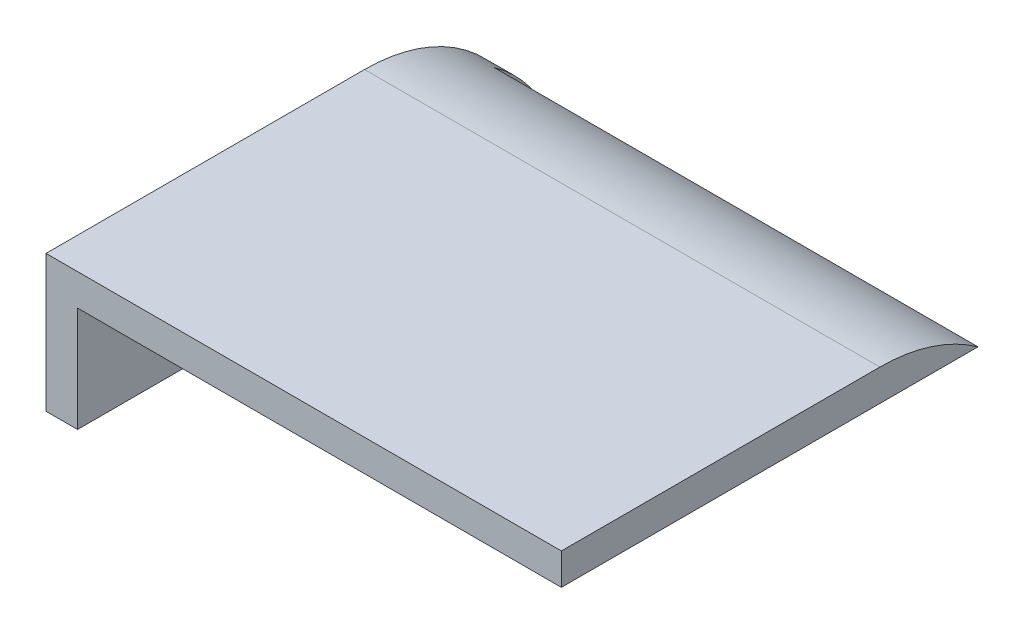
ISO-10303-21;
HEADER;
FILE_DESCRIPTION(('STEP AP214'),'2;1');
FILE_NAME('part.step','',(''),(''),'','','');
FILE_SCHEMA(('AUTOMOTIVE_DESIGN { 1 0 10303 214 1 1 1 1 }'));
ENDSEC;
DATA;
#1=APPLICATION_CONTEXT('core data for automotive mechanical design processes');
#2=APPLICATION_PROTOCOL_DEFINITION('international standard','automotive_design',2000,#1);
#3=PRODUCT_CONTEXT('',#1,'mechanical');
#4=PRODUCT('Part','Part','',(#3));
#5=PRODUCT_RELATED_PRODUCT_CATEGORY('part','',(#4));
#6=PRODUCT_DEFINITION_FORMATION('','',#4);
#7=PRODUCT_DEFINITION_CONTEXT('part definition',#1,'design');
#8=PRODUCT_DEFINITION('design','',#6,#7);
#9=PRODUCT_DEFINITION_SHAPE('','',#8);
#10=(LENGTH_UNIT() NAMED_UNIT(*) SI_UNIT(.MILLI.,.METRE.));
#11=(NAMED_UNIT(*) PLANE_ANGLE_UNIT() SI_UNIT($,.RADIAN.));
#12=(NAMED_UNIT(*) SI_UNIT($,.STERADIAN.) SOLID_ANGLE_UNIT());
#13=UNCERTAINTY_MEASURE_WITH_UNIT(LENGTH_MEASURE(1.E-05),#10,'distance_accuracy_value','');
#14=(GEOMETRIC_REPRESENTATION_CONTEXT(3) GLOBAL_UNCERTAINTY_ASSIGNED_CONTEXT((#13)) GLOBAL_UNIT_ASSIGNED_CONTEXT((#10,
#11,#12)) REPRESENTATION_CONTEXT('',''));
#15=CARTESIAN_POINT('',(0.,0.,0.));
#16=DIRECTION('',(0.,0.,1.));
#17=DIRECTION('',(1.,0.,0.));
#18=AXIS2_PLACEMENT_3D('',#15,#16,#17);
#19=CARTESIAN_POINT('',(3.,0.,46.));
#20=DIRECTION('',(0.,1.,0.));
#21=DIRECTION('',(-1.,0.,0.));
#22=AXIS2_PLACEMENT_3D('',#19,#20,#21);
#23=PLANE('',#22);
#24=DIRECTION('',(1.,0.,0.));
#25=VECTOR('',#24,1.);
#26=CARTESIAN_POINT('',(3.,0.,0.));
#27=LINE('',#26,#25);
#28=CARTESIAN_POINT('',(0.,0.,0.));
#29=VERTEX_POINT('',#28);
#30=CARTESIAN_POINT('',(3.,0.,0.));
#31=VERTEX_POINT('',#30);
#32=EDGE_CURVE('E102',#29,#31,#27,.T.);
#33=ORIENTED_EDGE('',*,*,#32,.T.);
#34=DIRECTION('',(0.,0.,-1.));
#35=VECTOR('',#34,1.);
#36=CARTESIAN_POINT('',(3.,0.,46.));
#37=LINE('',#36,#35);
#38=CARTESIAN_POINT('',(3.,0.,46.));
#39=VERTEX_POINT('',#38);
#40=EDGE_CURVE('E87',#39,#31,#37,.T.);
#41=ORIENTED_EDGE('',*,*,#40,.F.);
#42=DIRECTION('',(1.,0.,0.));
#43=VECTOR('',#42,1.);
#44=CARTESIAN_POINT('',(3.,0.,46.));
#45=LINE('',#44,#43);
#46=CARTESIAN_POINT('',(0.,0.,46.));
#47=VERTEX_POINT('',#46);
#48=EDGE_CURVE('E93',#47,#39,#45,.T.);
#49=ORIENTED_EDGE('',*,*,#48,.F.);
#50=DIRECTION('',(0.,0.,-1.));
#51=VECTOR('',#50,1.);
#52=CARTESIAN_POINT('',(0.,0.,46.));
#53=LINE('',#52,#51);
#54=EDGE_CURVE('E118',#47,#29,#53,.T.);
#55=ORIENTED_EDGE('',*,*,#54,.T.);
#56=EDGE_LOOP('',(#33,#41,#49,#55));
#57=FACE_BOUND('',#56,.T.);
#58=ADVANCED_FACE('F33',(#57),#23,.F.);
#59=CARTESIAN_POINT('',(3.,9.99999999999999,46.));
#60=DIRECTION('',(-1.,0.,0.));
#61=DIRECTION('',(0.,-1.,0.));
#62=AXIS2_PLACEMENT_3D('',#59,#60,#61);
#63=PLANE('',#62);
#64=ORIENTED_EDGE('',*,*,#40,.T.);
#65=CARTESIAN_POINT('',(3.,-3.,15.7162336455017));
#66=DIRECTION('',(-1.,0.,0.));
#67=DIRECTION('',(0.,-1.,0.));
#68=AXIS2_PLACEMENT_3D('',#65,#66,#67);
#69=CIRCLE('',#68,16.);
#70=CARTESIAN_POINT('',(3.,9.99999999999999,6.3888545924129));
#71=VERTEX_POINT('',#70);
#72=EDGE_CURVE('E55',#31,#71,#69,.F.);
#73=ORIENTED_EDGE('',*,*,#72,.T.);
#74=DIRECTION('',(0.,0.,-1.));
#75=VECTOR('',#74,1.);
#76=CARTESIAN_POINT('',(3.,9.99999999999999,46.));
#77=LINE('',#76,#75);
#78=CARTESIAN_POINT('',(3.,9.99999999999999,46.));
#79=VERTEX_POINT('',#78);
#80=EDGE_CURVE('E89',#79,#71,#77,.T.);
#81=ORIENTED_EDGE('',*,*,#80,.F.);
#82=DIRECTION('',(0.,1.,0.));
#83=VECTOR('',#82,1.);
#84=CARTESIAN_POINT('',(3.,9.99999999999999,46.));
#85=LINE('',#84,#83);
#86=EDGE_CURVE('E83',#39,#79,#85,.T.);
#87=ORIENTED_EDGE('',*,*,#86,.F.);
#88=EDGE_LOOP('',(#64,#73,#81,#87));
#89=FACE_BOUND('',#88,.T.);
#90=ADVANCED_FACE('F85',(#89),#63,.F.);
#91=CARTESIAN_POINT('',(49.,10.,46.));
#92=DIRECTION('',(0.,1.,0.));
#93=DIRECTION('',(-1.,0.,0.));
#94=AXIS2_PLACEMENT_3D('',#91,#92,#93);
#95=PLANE('',#94);
#96=ORIENTED_EDGE('',*,*,#80,.T.);
#97=DIRECTION('',(1.,0.,0.));
#98=VECTOR('',#97,1.);
#99=CARTESIAN_POINT('',(3.,9.99999999999999,6.38885459241289));
#100=LINE('',#99,#98);
#101=CARTESIAN_POINT('',(49.,10.,6.3888545924129));
#102=VERTEX_POINT('',#101);
#103=EDGE_CURVE('E41',#71,#102,#100,.T.);
#104=ORIENTED_EDGE('',*,*,#103,.T.);
#105=DIRECTION('',(0.,0.,-1.));
#106=VECTOR('',#105,1.);
#107=CARTESIAN_POINT('',(49.,10.,46.));
#108=LINE('',#107,#106);
#109=CARTESIAN_POINT('',(49.,10.,46.));
#110=VERTEX_POINT('',#109);
#111=EDGE_CURVE('E110',#110,#102,#108,.T.);
#112=ORIENTED_EDGE('',*,*,#111,.F.);
#113=DIRECTION('',(1.,0.,0.));
#114=VECTOR('',#113,1.);
#115=CARTESIAN_POINT('',(49.,10.,46.));
#116=LINE('',#115,#114);
#117=EDGE_CURVE('E92',#79,#110,#116,.T.);
#118=ORIENTED_EDGE('',*,*,#117,.F.);
#119=EDGE_LOOP('',(#96,#104,#112,#118));
#120=FACE_BOUND('',#119,.T.);
#121=ADVANCED_FACE('F143',(#120),#95,.F.);
#122=CARTESIAN_POINT('',(49.,13.,46.));
#123=DIRECTION('',(-1.,0.,0.));
#124=DIRECTION('',(0.,0.,1.));
#125=AXIS2_PLACEMENT_3D('',#122,#123,#124);
#126=PLANE('',#125);
#127=ORIENTED_EDGE('',*,*,#111,.T.);
#128=CARTESIAN_POINT('',(49.,-3.00000000000001,15.7162336455017));
#129=DIRECTION('',(-1.,0.,0.));
#130=DIRECTION('',(0.,0.,1.));
#131=AXIS2_PLACEMENT_3D('',#128,#129,#130);
#132=CIRCLE('',#131,16.);
#133=CARTESIAN_POINT('',(49.,13.,15.7162336455017));
#134=VERTEX_POINT('',#133);
#135=EDGE_CURVE('E11',#102,#134,#132,.F.);
#136=ORIENTED_EDGE('',*,*,#135,.T.);
#137=DIRECTION('',(0.,0.,-1.));
#138=VECTOR('',#137,1.);
#139=CARTESIAN_POINT('',(49.,13.,46.));
#140=LINE('',#139,#138);
#141=CARTESIAN_POINT('',(49.,13.,46.));
#142=VERTEX_POINT('',#141);
#143=EDGE_CURVE('E129',#142,#134,#140,.T.);
#144=ORIENTED_EDGE('',*,*,#143,.F.);
#145=DIRECTION('',(0.,1.,0.));
#146=VECTOR('',#145,1.);
#147=CARTESIAN_POINT('',(49.,13.,46.));
#148=LINE('',#147,#146);
#149=EDGE_CURVE('E136',#110,#142,#148,.T.);
#150=ORIENTED_EDGE('',*,*,#149,.F.);
#151=EDGE_LOOP('',(#127,#136,#144,#150));
#152=FACE_BOUND('',#151,.T.);
#153=ADVANCED_FACE('F134',(#152),#126,.F.);
#154=CARTESIAN_POINT('',(0.,13.,46.));
#155=DIRECTION('',(0.,-1.,0.));
#156=DIRECTION('',(0.,0.,-1.));
#157=AXIS2_PLACEMENT_3D('',#154,#155,#156);
#158=PLANE('',#157);
#159=ORIENTED_EDGE('',*,*,#143,.T.);
#160=DIRECTION('',(1.,0.,0.));
#161=VECTOR('',#160,1.);
#162=CARTESIAN_POINT('',(0.,13.,15.7162336455017));
#163=LINE('',#162,#161);
#164=CARTESIAN_POINT('',(0.,13.,15.7162336455017));
#165=VERTEX_POINT('',#164);
#166=EDGE_CURVE('E105',#134,#165,#163,.F.);
#167=ORIENTED_EDGE('',*,*,#166,.T.);
#168=DIRECTION('',(0.,0.,-1.));
#169=VECTOR('',#168,1.);
#170=CARTESIAN_POINT('',(0.,13.,46.));
#171=LINE('',#170,#169);
#172=CARTESIAN_POINT('',(0.,13.,46.));
#173=VERTEX_POINT('',#172);
#174=EDGE_CURVE('E120',#173,#165,#171,.T.);
#175=ORIENTED_EDGE('',*,*,#174,.F.);
#176=DIRECTION('',(-1.,0.,0.));
#177=VECTOR('',#176,1.);
#178=CARTESIAN_POINT('',(0.,13.,46.));
#179=LINE('',#178,#177);
#180=EDGE_CURVE('E140',#142,#173,#179,.T.);
#181=ORIENTED_EDGE('',*,*,#180,.F.);
#182=EDGE_LOOP('',(#159,#167,#175,#181));
#183=FACE_BOUND('',#182,.T.);
#184=ADVANCED_FACE('F138',(#183),#158,.F.);
#185=CARTESIAN_POINT('',(0.,0.,46.));
#186=DIRECTION('',(1.,0.,0.));
#187=DIRECTION('',(0.,0.,-1.));
#188=AXIS2_PLACEMENT_3D('',#185,#186,#187);
#189=PLANE('',#188);
#190=ORIENTED_EDGE('',*,*,#174,.T.);
#191=CARTESIAN_POINT('',(0.,-3.,15.7162336455017));
#192=DIRECTION('',(1.,0.,0.));
#193=DIRECTION('',(0.,0.,-1.));
#194=AXIS2_PLACEMENT_3D('',#191,#192,#193);
#195=CIRCLE('',#194,16.);
#196=EDGE_CURVE('E108',#165,#29,#195,.F.);
#197=ORIENTED_EDGE('',*,*,#196,.T.);
#198=ORIENTED_EDGE('',*,*,#54,.F.);
#199=DIRECTION('',(0.,-1.,0.));
#200=VECTOR('',#199,1.);
#201=CARTESIAN_POINT('',(0.,0.,46.));
#202=LINE('',#201,#200);
#203=EDGE_CURVE('E98',#173,#47,#202,.T.);
#204=ORIENTED_EDGE('',*,*,#203,.F.);
#205=EDGE_LOOP('',(#190,#197,#198,#204));
#206=FACE_BOUND('',#205,.T.);
#207=ADVANCED_FACE('F117',(#206),#189,.F.);
#208=CARTESIAN_POINT('',(0.,0.,46.));
#209=DIRECTION('',(0.,0.,-1.));
#210=DIRECTION('',(-1.,0.,0.));
#211=AXIS2_PLACEMENT_3D('',#208,#209,#210);
#212=PLANE('',#211);
#213=ORIENTED_EDGE('',*,*,#48,.T.);
#214=ORIENTED_EDGE('',*,*,#86,.T.);
#215=ORIENTED_EDGE('',*,*,#117,.T.);
#216=ORIENTED_EDGE('',*,*,#149,.T.);
#217=ORIENTED_EDGE('',*,*,#180,.T.);
#218=ORIENTED_EDGE('',*,*,#203,.T.);
#219=EDGE_LOOP('',(#213,#214,#215,#216,#217,#218));
#220=FACE_BOUND('',#219,.T.);
#221=ADVANCED_FACE('F96',(#220),#212,.F.);
#222=CARTESIAN_POINT('',(0.,-3.,15.7162336455017));
#223=DIRECTION('',(1.,0.,0.));
#224=DIRECTION('',(0.,1.,0.));
#225=AXIS2_PLACEMENT_3D('',#222,#223,#224);
#226=CYLINDRICAL_SURFACE('',#225,16.);
#227=ORIENTED_EDGE('',*,*,#72,.F.);
#228=ORIENTED_EDGE('',*,*,#32,.F.);
#229=ORIENTED_EDGE('',*,*,#196,.F.);
#230=ORIENTED_EDGE('',*,*,#166,.F.);
#231=ORIENTED_EDGE('',*,*,#135,.F.);
#232=ORIENTED_EDGE('',*,*,#103,.F.);
#233=EDGE_LOOP('',(#227,#228,#229,#230,#231,#232));
#234=FACE_BOUND('',#233,.T.);
#235=ADVANCED_FACE('F35',(#234),#226,.T.);
#236=CLOSED_SHELL('',(#58,#90,#121,#153,#184,#207,#221,#235));
#237=MANIFOLD_SOLID_BREP('B2',#236);
#238=ADVANCED_BREP_SHAPE_REPRESENTATION('',(#18,#237),#14);
#239=SHAPE_DEFINITION_REPRESENTATION(#9,#238);
ENDSEC;
END-ISO-10303-21;
